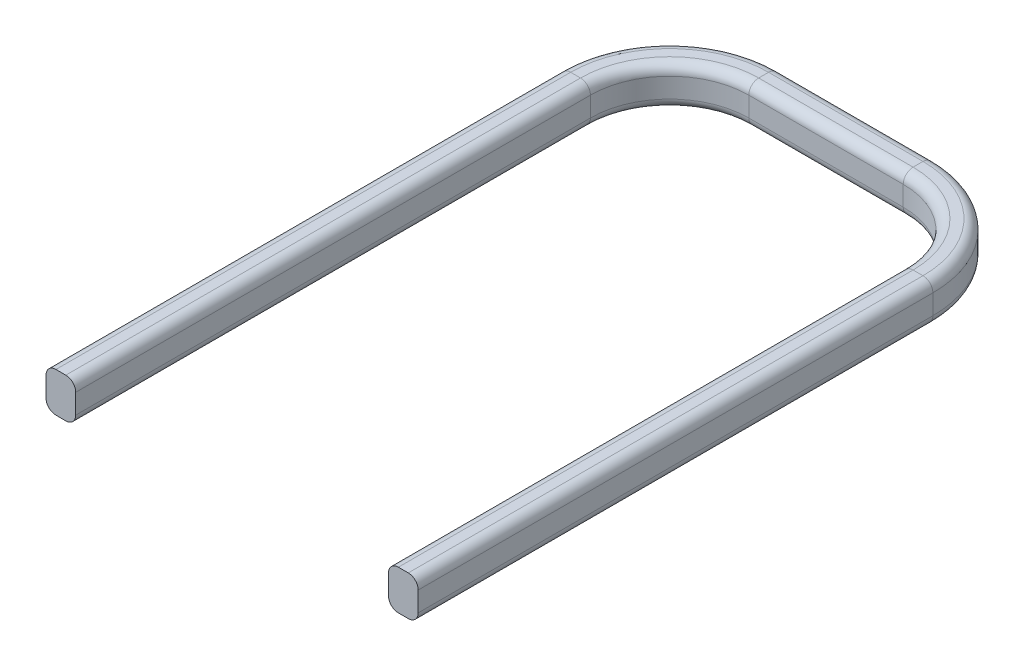
ISO-10303-21;
HEADER;
FILE_DESCRIPTION(('STEP AP214'),'2;1');
FILE_NAME('part.step','',(''),(''),'','','');
FILE_SCHEMA(('AUTOMOTIVE_DESIGN { 1 0 10303 214 1 1 1 1 }'));
ENDSEC;
DATA;
#1=APPLICATION_CONTEXT('core data for automotive mechanical design processes');
#2=APPLICATION_PROTOCOL_DEFINITION('international standard','automotive_design',2000,#1);
#3=PRODUCT_CONTEXT('',#1,'mechanical');
#4=PRODUCT('Part','Part','',(#3));
#5=PRODUCT_RELATED_PRODUCT_CATEGORY('part','',(#4));
#6=PRODUCT_DEFINITION_FORMATION('','',#4);
#7=PRODUCT_DEFINITION_CONTEXT('part definition',#1,'design');
#8=PRODUCT_DEFINITION('design','',#6,#7);
#9=PRODUCT_DEFINITION_SHAPE('','',#8);
#10=(LENGTH_UNIT() NAMED_UNIT(*) SI_UNIT(.MILLI.,.METRE.));
#11=(NAMED_UNIT(*) PLANE_ANGLE_UNIT() SI_UNIT($,.RADIAN.));
#12=(NAMED_UNIT(*) SI_UNIT($,.STERADIAN.) SOLID_ANGLE_UNIT());
#13=UNCERTAINTY_MEASURE_WITH_UNIT(LENGTH_MEASURE(1.E-05),#10,'distance_accuracy_value','');
#14=(GEOMETRIC_REPRESENTATION_CONTEXT(3) GLOBAL_UNCERTAINTY_ASSIGNED_CONTEXT((#13)) GLOBAL_UNIT_ASSIGNED_CONTEXT((#10,
#11,#12)) REPRESENTATION_CONTEXT('',''));
#15=CARTESIAN_POINT('',(0.,0.,0.));
#16=DIRECTION('',(0.,0.,1.));
#17=DIRECTION('',(1.,0.,0.));
#18=AXIS2_PLACEMENT_3D('',#15,#16,#17);
#19=CARTESIAN_POINT('',(0.,0.,0.));
#20=DIRECTION('',(0.,0.,1.));
#21=DIRECTION('',(1.,0.,0.));
#22=AXIS2_PLACEMENT_3D('',#19,#20,#21);
#23=PLANE('',#22);
#24=DIRECTION('',(0.,-1.,0.));
#25=VECTOR('',#24,1.);
#26=CARTESIAN_POINT('',(-2.0915,0.,0.));
#27=LINE('',#26,#25);
#28=CARTESIAN_POINT('',(-2.0915,0.33375,0.));
#29=VERTEX_POINT('',#28);
#30=CARTESIAN_POINT('',(-2.0915,0.11125,0.));
#31=VERTEX_POINT('',#30);
#32=EDGE_CURVE('E373',#29,#31,#27,.T.);
#33=ORIENTED_EDGE('',*,*,#32,.T.);
#34=CARTESIAN_POINT('',(-1.98025,0.11125,0.));
#35=DIRECTION('',(0.,0.,1.));
#36=DIRECTION('',(1.,0.,0.));
#37=AXIS2_PLACEMENT_3D('',#34,#35,#36);
#38=CIRCLE('',#37,0.11125);
#39=CARTESIAN_POINT('',(-1.98025,0.,0.));
#40=VERTEX_POINT('',#39);
#41=EDGE_CURVE('E308',#31,#40,#38,.T.);
#42=ORIENTED_EDGE('',*,*,#41,.T.);
#43=DIRECTION('',(1.,0.,0.));
#44=VECTOR('',#43,1.);
#45=CARTESIAN_POINT('',(-1.75775,0.,0.));
#46=LINE('',#45,#44);
#47=CARTESIAN_POINT('',(-1.869,0.,0.));
#48=VERTEX_POINT('',#47);
#49=EDGE_CURVE('E381',#40,#48,#46,.T.);
#50=ORIENTED_EDGE('',*,*,#49,.T.);
#51=CARTESIAN_POINT('',(-1.869,0.11125,0.));
#52=DIRECTION('',(0.,0.,1.));
#53=DIRECTION('',(1.,0.,0.));
#54=AXIS2_PLACEMENT_3D('',#51,#52,#53);
#55=CIRCLE('',#54,0.11125);
#56=CARTESIAN_POINT('',(-1.75775,0.11125,0.));
#57=VERTEX_POINT('',#56);
#58=EDGE_CURVE('E306',#48,#57,#55,.T.);
#59=ORIENTED_EDGE('',*,*,#58,.T.);
#60=DIRECTION('',(0.,1.,0.));
#61=VECTOR('',#60,1.);
#62=CARTESIAN_POINT('',(-1.75775,0.,0.));
#63=LINE('',#62,#61);
#64=CARTESIAN_POINT('',(-1.75775,0.33375,0.));
#65=VERTEX_POINT('',#64);
#66=EDGE_CURVE('E327',#57,#65,#63,.T.);
#67=ORIENTED_EDGE('',*,*,#66,.T.);
#68=CARTESIAN_POINT('',(-1.869,0.33375,0.));
#69=DIRECTION('',(0.,0.,1.));
#70=DIRECTION('',(1.,0.,0.));
#71=AXIS2_PLACEMENT_3D('',#68,#69,#70);
#72=CIRCLE('',#71,0.11125);
#73=CARTESIAN_POINT('',(-1.869,0.445,0.));
#74=VERTEX_POINT('',#73);
#75=EDGE_CURVE('E55',#65,#74,#72,.T.);
#76=ORIENTED_EDGE('',*,*,#75,.T.);
#77=DIRECTION('',(-1.,0.,0.));
#78=VECTOR('',#77,1.);
#79=CARTESIAN_POINT('',(-1.75775,0.445,0.));
#80=LINE('',#79,#78);
#81=CARTESIAN_POINT('',(-1.98025,0.445,0.));
#82=VERTEX_POINT('',#81);
#83=EDGE_CURVE('E375',#74,#82,#80,.T.);
#84=ORIENTED_EDGE('',*,*,#83,.T.);
#85=CARTESIAN_POINT('',(-1.98025,0.33375,0.));
#86=DIRECTION('',(0.,0.,1.));
#87=DIRECTION('',(1.,0.,0.));
#88=AXIS2_PLACEMENT_3D('',#85,#86,#87);
#89=CIRCLE('',#88,0.11125);
#90=EDGE_CURVE('E303',#82,#29,#89,.T.);
#91=ORIENTED_EDGE('',*,*,#90,.T.);
#92=EDGE_LOOP('',(#33,#42,#50,#59,#67,#76,#84,#91));
#93=FACE_BOUND('',#92,.T.);
#94=ADVANCED_FACE('F32',(#93),#23,.T.);
#95=CARTESIAN_POINT('',(0.,0.,0.));
#96=DIRECTION('',(0.,0.,-1.));
#97=DIRECTION('',(-1.,0.,0.));
#98=AXIS2_PLACEMENT_3D('',#95,#96,#97);
#99=PLANE('',#98);
#100=DIRECTION('',(-1.,0.,0.));
#101=VECTOR('',#100,1.);
#102=CARTESIAN_POINT('',(1.75775,0.,0.));
#103=LINE('',#102,#101);
#104=CARTESIAN_POINT('',(1.98025,0.,0.));
#105=VERTEX_POINT('',#104);
#106=CARTESIAN_POINT('',(1.869,0.,0.));
#107=VERTEX_POINT('',#106);
#108=EDGE_CURVE('E212',#105,#107,#103,.T.);
#109=ORIENTED_EDGE('',*,*,#108,.F.);
#110=CARTESIAN_POINT('',(1.98025,0.11125,0.));
#111=DIRECTION('',(0.,0.,-1.));
#112=DIRECTION('',(-1.,0.,0.));
#113=AXIS2_PLACEMENT_3D('',#110,#111,#112);
#114=CIRCLE('',#113,0.11125);
#115=CARTESIAN_POINT('',(2.0915,0.11125,0.));
#116=VERTEX_POINT('',#115);
#117=EDGE_CURVE('E195',#105,#116,#114,.F.);
#118=ORIENTED_EDGE('',*,*,#117,.T.);
#119=DIRECTION('',(0.,-1.,0.));
#120=VECTOR('',#119,1.);
#121=CARTESIAN_POINT('',(2.0915,0.,0.));
#122=LINE('',#121,#120);
#123=CARTESIAN_POINT('',(2.0915,0.33375,0.));
#124=VERTEX_POINT('',#123);
#125=EDGE_CURVE('E222',#124,#116,#122,.T.);
#126=ORIENTED_EDGE('',*,*,#125,.F.);
#127=CARTESIAN_POINT('',(1.98025,0.33375,0.));
#128=DIRECTION('',(0.,0.,-1.));
#129=DIRECTION('',(-1.,0.,0.));
#130=AXIS2_PLACEMENT_3D('',#127,#128,#129);
#131=CIRCLE('',#130,0.11125);
#132=CARTESIAN_POINT('',(1.98025,0.445,0.));
#133=VERTEX_POINT('',#132);
#134=EDGE_CURVE('E217',#124,#133,#131,.F.);
#135=ORIENTED_EDGE('',*,*,#134,.T.);
#136=DIRECTION('',(1.,0.,0.));
#137=VECTOR('',#136,1.);
#138=CARTESIAN_POINT('',(1.75775,0.445,0.));
#139=LINE('',#138,#137);
#140=CARTESIAN_POINT('',(1.869,0.445,0.));
#141=VERTEX_POINT('',#140);
#142=EDGE_CURVE('E225',#141,#133,#139,.T.);
#143=ORIENTED_EDGE('',*,*,#142,.F.);
#144=CARTESIAN_POINT('',(1.869,0.33375,0.));
#145=DIRECTION('',(0.,0.,-1.));
#146=DIRECTION('',(-1.,0.,0.));
#147=AXIS2_PLACEMENT_3D('',#144,#145,#146);
#148=CIRCLE('',#147,0.11125);
#149=CARTESIAN_POINT('',(1.75775,0.33375,0.));
#150=VERTEX_POINT('',#149);
#151=EDGE_CURVE('E231',#141,#150,#148,.F.);
#152=ORIENTED_EDGE('',*,*,#151,.T.);
#153=DIRECTION('',(0.,1.,0.));
#154=VECTOR('',#153,1.);
#155=CARTESIAN_POINT('',(1.75775,0.,0.));
#156=LINE('',#155,#154);
#157=CARTESIAN_POINT('',(1.75775,0.11125,0.));
#158=VERTEX_POINT('',#157);
#159=EDGE_CURVE('E427',#158,#150,#156,.T.);
#160=ORIENTED_EDGE('',*,*,#159,.F.);
#161=CARTESIAN_POINT('',(1.869,0.11125,0.));
#162=DIRECTION('',(0.,0.,-1.));
#163=DIRECTION('',(-1.,0.,0.));
#164=AXIS2_PLACEMENT_3D('',#161,#162,#163);
#165=CIRCLE('',#164,0.11125);
#166=EDGE_CURVE('E206',#158,#107,#165,.F.);
#167=ORIENTED_EDGE('',*,*,#166,.T.);
#168=EDGE_LOOP('',(#109,#118,#126,#135,#143,#152,#160,#167));
#169=FACE_BOUND('',#168,.T.);
#170=ADVANCED_FACE('F220',(#169),#99,.F.);
#171=CARTESIAN_POINT('',(-1.75775,0.,0.));
#172=DIRECTION('',(-1.,0.,0.));
#173=DIRECTION('',(0.,0.,1.));
#174=AXIS2_PLACEMENT_3D('',#171,#172,#173);
#175=PLANE('',#174);
#176=ORIENTED_EDGE('',*,*,#66,.F.);
#177=DIRECTION('',(0.,0.,-1.));
#178=VECTOR('',#177,1.);
#179=CARTESIAN_POINT('',(-1.75775,0.11125,0.));
#180=LINE('',#179,#178);
#181=CARTESIAN_POINT('',(-1.75775,0.11125,-5.78499999999999));
#182=VERTEX_POINT('',#181);
#183=EDGE_CURVE('E312',#57,#182,#180,.T.);
#184=ORIENTED_EDGE('',*,*,#183,.T.);
#185=DIRECTION('',(0.,1.,0.));
#186=VECTOR('',#185,1.);
#187=CARTESIAN_POINT('',(-1.75775,0.,-5.78499999999999));
#188=LINE('',#187,#186);
#189=CARTESIAN_POINT('',(-1.75775,0.33375,-5.78499999999999));
#190=VERTEX_POINT('',#189);
#191=EDGE_CURVE('E384',#182,#190,#188,.T.);
#192=ORIENTED_EDGE('',*,*,#191,.T.);
#193=DIRECTION('',(0.,0.,-1.));
#194=VECTOR('',#193,1.);
#195=CARTESIAN_POINT('',(-1.75775,0.33375,0.));
#196=LINE('',#195,#194);
#197=EDGE_CURVE('E310',#190,#65,#196,.F.);
#198=ORIENTED_EDGE('',*,*,#197,.T.);
#199=EDGE_LOOP('',(#176,#184,#192,#198));
#200=FACE_BOUND('',#199,.T.);
#201=ADVANCED_FACE('F491',(#200),#175,.F.);
#202=CARTESIAN_POINT('',(-1.75775,0.445,0.));
#203=DIRECTION('',(0.,-1.,0.));
#204=DIRECTION('',(1.,0.,0.));
#205=AXIS2_PLACEMENT_3D('',#202,#203,#204);
#206=PLANE('',#205);
#207=ORIENTED_EDGE('',*,*,#83,.F.);
#208=DIRECTION('',(0.,0.,-1.));
#209=VECTOR('',#208,1.);
#210=CARTESIAN_POINT('',(-1.869,0.445,0.));
#211=LINE('',#210,#209);
#212=CARTESIAN_POINT('',(-1.869,0.445,-5.78499999999999));
#213=VERTEX_POINT('',#212);
#214=EDGE_CURVE('E11',#74,#213,#211,.T.);
#215=ORIENTED_EDGE('',*,*,#214,.T.);
#216=DIRECTION('',(-1.,0.,0.));
#217=VECTOR('',#216,1.);
#218=CARTESIAN_POINT('',(-1.75775,0.445,-5.78499999999999));
#219=LINE('',#218,#217);
#220=CARTESIAN_POINT('',(-1.98025,0.445,-5.78499999999999));
#221=VERTEX_POINT('',#220);
#222=EDGE_CURVE('E393',#213,#221,#219,.T.);
#223=ORIENTED_EDGE('',*,*,#222,.T.);
#224=DIRECTION('',(0.,0.,-1.));
#225=VECTOR('',#224,1.);
#226=CARTESIAN_POINT('',(-1.98025,0.445,0.));
#227=LINE('',#226,#225);
#228=EDGE_CURVE('E41',#221,#82,#227,.F.);
#229=ORIENTED_EDGE('',*,*,#228,.T.);
#230=EDGE_LOOP('',(#207,#215,#223,#229));
#231=FACE_BOUND('',#230,.T.);
#232=ADVANCED_FACE('F497',(#231),#206,.F.);
#233=CARTESIAN_POINT('',(-2.0915,0.,0.));
#234=DIRECTION('',(1.,0.,0.));
#235=DIRECTION('',(0.,0.,-1.));
#236=AXIS2_PLACEMENT_3D('',#233,#234,#235);
#237=PLANE('',#236);
#238=DIRECTION('',(0.,-1.,0.));
#239=VECTOR('',#238,1.);
#240=CARTESIAN_POINT('',(-2.0915,0.,-5.78499999999999));
#241=LINE('',#240,#239);
#242=CARTESIAN_POINT('',(-2.0915,0.33375,-5.78499999999999));
#243=VERTEX_POINT('',#242);
#244=CARTESIAN_POINT('',(-2.0915,0.11125,-5.78499999999999));
#245=VERTEX_POINT('',#244);
#246=EDGE_CURVE('E390',#243,#245,#241,.T.);
#247=ORIENTED_EDGE('',*,*,#246,.T.);
#248=DIRECTION('',(0.,0.,-1.));
#249=VECTOR('',#248,1.);
#250=CARTESIAN_POINT('',(-2.0915,0.11125,0.));
#251=LINE('',#250,#249);
#252=EDGE_CURVE('E301',#245,#31,#251,.F.);
#253=ORIENTED_EDGE('',*,*,#252,.T.);
#254=ORIENTED_EDGE('',*,*,#32,.F.);
#255=DIRECTION('',(0.,0.,-1.));
#256=VECTOR('',#255,1.);
#257=CARTESIAN_POINT('',(-2.0915,0.33375,0.));
#258=LINE('',#257,#256);
#259=EDGE_CURVE('E299',#29,#243,#258,.T.);
#260=ORIENTED_EDGE('',*,*,#259,.T.);
#261=EDGE_LOOP('',(#247,#253,#254,#260));
#262=FACE_BOUND('',#261,.T.);
#263=ADVANCED_FACE('F378',(#262),#237,.F.);
#264=CARTESIAN_POINT('',(-1.75775,0.,0.));
#265=DIRECTION('',(0.,1.,0.));
#266=DIRECTION('',(-1.,0.,0.));
#267=AXIS2_PLACEMENT_3D('',#264,#265,#266);
#268=PLANE('',#267);
#269=ORIENTED_EDGE('',*,*,#49,.F.);
#270=DIRECTION('',(0.,0.,-1.));
#271=VECTOR('',#270,1.);
#272=CARTESIAN_POINT('',(-1.98025,0.,0.));
#273=LINE('',#272,#271);
#274=CARTESIAN_POINT('',(-1.98025,0.,-5.78499999999999));
#275=VERTEX_POINT('',#274);
#276=EDGE_CURVE('E297',#40,#275,#273,.T.);
#277=ORIENTED_EDGE('',*,*,#276,.T.);
#278=DIRECTION('',(1.,0.,0.));
#279=VECTOR('',#278,1.);
#280=CARTESIAN_POINT('',(-1.75775,0.,-5.78499999999999));
#281=LINE('',#280,#279);
#282=CARTESIAN_POINT('',(-1.869,0.,-5.78499999999999));
#283=VERTEX_POINT('',#282);
#284=EDGE_CURVE('E392',#275,#283,#281,.T.);
#285=ORIENTED_EDGE('',*,*,#284,.T.);
#286=DIRECTION('',(0.,0.,-1.));
#287=VECTOR('',#286,1.);
#288=CARTESIAN_POINT('',(-1.869,0.,0.));
#289=LINE('',#288,#287);
#290=EDGE_CURVE('E295',#283,#48,#289,.F.);
#291=ORIENTED_EDGE('',*,*,#290,.T.);
#292=EDGE_LOOP('',(#269,#277,#285,#291));
#293=FACE_BOUND('',#292,.T.);
#294=ADVANCED_FACE('F504',(#293),#268,.F.);
#295=CARTESIAN_POINT('',(-0.86775,0.,-5.785));
#296=DIRECTION('',(0.,-1.,0.));
#297=DIRECTION('',(0.,0.,-1.));
#298=AXIS2_PLACEMENT_3D('',#295,#296,#297);
#299=CYLINDRICAL_SURFACE('',#298,0.89);
#300=ORIENTED_EDGE('',*,*,#191,.F.);
#301=CARTESIAN_POINT('',(-0.86775,0.11125,-5.785));
#302=DIRECTION('',(0.,1.,0.));
#303=DIRECTION('',(0.,0.,1.));
#304=AXIS2_PLACEMENT_3D('',#301,#302,#303);
#305=CIRCLE('',#304,0.89);
#306=CARTESIAN_POINT('',(-0.86775,0.11125,-6.675));
#307=VERTEX_POINT('',#306);
#308=EDGE_CURVE('E276',#182,#307,#305,.F.);
#309=ORIENTED_EDGE('',*,*,#308,.T.);
#310=DIRECTION('',(0.,1.,0.));
#311=VECTOR('',#310,1.);
#312=CARTESIAN_POINT('',(-0.86775,0.,-6.675));
#313=LINE('',#312,#311);
#314=CARTESIAN_POINT('',(-0.86775,0.33375,-6.675));
#315=VERTEX_POINT('',#314);
#316=EDGE_CURVE('E410',#307,#315,#313,.T.);
#317=ORIENTED_EDGE('',*,*,#316,.T.);
#318=CARTESIAN_POINT('',(-0.86775,0.33375,-5.785));
#319=DIRECTION('',(0.,-1.,0.));
#320=DIRECTION('',(0.,0.,-1.));
#321=AXIS2_PLACEMENT_3D('',#318,#319,#320);
#322=CIRCLE('',#321,0.89);
#323=EDGE_CURVE('E274',#315,#190,#322,.F.);
#324=ORIENTED_EDGE('',*,*,#323,.T.);
#325=EDGE_LOOP('',(#300,#309,#317,#324));
#326=FACE_BOUND('',#325,.T.);
#327=ADVANCED_FACE('F486',(#326),#299,.F.);
#328=CARTESIAN_POINT('',(-1.75775,0.445,-5.78500000000001));
#329=DIRECTION('',(0.,-1.,0.));
#330=DIRECTION('',(0.,0.,-1.));
#331=AXIS2_PLACEMENT_3D('',#328,#329,#330);
#332=PLANE('',#331);
#333=ORIENTED_EDGE('',*,*,#222,.F.);
#334=CARTESIAN_POINT('',(-0.86775,0.445,-5.785));
#335=DIRECTION('',(0.,-1.,0.));
#336=DIRECTION('',(0.,0.,-1.));
#337=AXIS2_PLACEMENT_3D('',#334,#335,#336);
#338=CIRCLE('',#337,1.00125);
#339=CARTESIAN_POINT('',(-0.86775,0.445,-6.78625));
#340=VERTEX_POINT('',#339);
#341=EDGE_CURVE('E293',#213,#340,#338,.T.);
#342=ORIENTED_EDGE('',*,*,#341,.T.);
#343=DIRECTION('',(0.,0.,-1.));
#344=VECTOR('',#343,1.);
#345=CARTESIAN_POINT('',(-0.86775,0.445,-6.675));
#346=LINE('',#345,#344);
#347=CARTESIAN_POINT('',(-0.86775,0.445,-6.8975));
#348=VERTEX_POINT('',#347);
#349=EDGE_CURVE('E398',#340,#348,#346,.T.);
#350=ORIENTED_EDGE('',*,*,#349,.T.);
#351=CARTESIAN_POINT('',(-0.86775,0.445,-5.785));
#352=DIRECTION('',(0.,-1.,0.));
#353=DIRECTION('',(0.,0.,-1.));
#354=AXIS2_PLACEMENT_3D('',#351,#352,#353);
#355=CIRCLE('',#354,1.1125);
#356=EDGE_CURVE('E291',#348,#221,#355,.F.);
#357=ORIENTED_EDGE('',*,*,#356,.T.);
#358=EDGE_LOOP('',(#333,#342,#350,#357));
#359=FACE_BOUND('',#358,.T.);
#360=ADVANCED_FACE('F477',(#359),#332,.F.);
#361=CARTESIAN_POINT('',(-0.86775,0.,-5.785));
#362=DIRECTION('',(0.,-1.,0.));
#363=DIRECTION('',(0.,0.,-1.));
#364=AXIS2_PLACEMENT_3D('',#361,#362,#363);
#365=CYLINDRICAL_SURFACE('',#364,1.22375);
#366=DIRECTION('',(0.,-1.,0.));
#367=VECTOR('',#366,1.);
#368=CARTESIAN_POINT('',(-0.86775,0.,-7.00875));
#369=LINE('',#368,#367);
#370=CARTESIAN_POINT('',(-0.86775,0.33375,-7.00875));
#371=VERTEX_POINT('',#370);
#372=CARTESIAN_POINT('',(-0.86775,0.11125,-7.00875));
#373=VERTEX_POINT('',#372);
#374=EDGE_CURVE('E394',#371,#373,#369,.T.);
#375=ORIENTED_EDGE('',*,*,#374,.T.);
#376=CARTESIAN_POINT('',(-0.86775,0.11125,-5.785));
#377=DIRECTION('',(0.,1.,0.));
#378=DIRECTION('',(0.,0.,1.));
#379=AXIS2_PLACEMENT_3D('',#376,#377,#378);
#380=CIRCLE('',#379,1.22375);
#381=EDGE_CURVE('E259',#373,#245,#380,.T.);
#382=ORIENTED_EDGE('',*,*,#381,.T.);
#383=ORIENTED_EDGE('',*,*,#246,.F.);
#384=CARTESIAN_POINT('',(-0.86775,0.33375,-5.785));
#385=DIRECTION('',(0.,-1.,0.));
#386=DIRECTION('',(0.,0.,-1.));
#387=AXIS2_PLACEMENT_3D('',#384,#385,#386);
#388=CIRCLE('',#387,1.22375);
#389=EDGE_CURVE('E257',#243,#371,#388,.T.);
#390=ORIENTED_EDGE('',*,*,#389,.T.);
#391=EDGE_LOOP('',(#375,#382,#383,#390));
#392=FACE_BOUND('',#391,.T.);
#393=ADVANCED_FACE('F752',(#392),#365,.T.);
#394=CARTESIAN_POINT('',(-1.75775,0.,-5.78500000000001));
#395=DIRECTION('',(0.,1.,0.));
#396=DIRECTION('',(0.,0.,1.));
#397=AXIS2_PLACEMENT_3D('',#394,#395,#396);
#398=PLANE('',#397);
#399=ORIENTED_EDGE('',*,*,#284,.F.);
#400=CARTESIAN_POINT('',(-0.86775,0.,-5.785));
#401=DIRECTION('',(0.,1.,0.));
#402=DIRECTION('',(0.,0.,1.));
#403=AXIS2_PLACEMENT_3D('',#400,#401,#402);
#404=CIRCLE('',#403,1.1125);
#405=CARTESIAN_POINT('',(-0.86775,0.,-6.8975));
#406=VERTEX_POINT('',#405);
#407=EDGE_CURVE('E255',#275,#406,#404,.F.);
#408=ORIENTED_EDGE('',*,*,#407,.T.);
#409=DIRECTION('',(0.,0.,1.));
#410=VECTOR('',#409,1.);
#411=CARTESIAN_POINT('',(-0.86775,0.,-6.675));
#412=LINE('',#411,#410);
#413=CARTESIAN_POINT('',(-0.86775,0.,-6.78625));
#414=VERTEX_POINT('',#413);
#415=EDGE_CURVE('E397',#406,#414,#412,.T.);
#416=ORIENTED_EDGE('',*,*,#415,.T.);
#417=CARTESIAN_POINT('',(-0.86775,0.,-5.785));
#418=DIRECTION('',(0.,1.,0.));
#419=DIRECTION('',(0.,0.,1.));
#420=AXIS2_PLACEMENT_3D('',#417,#418,#419);
#421=CIRCLE('',#420,1.00125);
#422=EDGE_CURVE('E253',#414,#283,#421,.T.);
#423=ORIENTED_EDGE('',*,*,#422,.T.);
#424=EDGE_LOOP('',(#399,#408,#416,#423));
#425=FACE_BOUND('',#424,.T.);
#426=ADVANCED_FACE('F743',(#425),#398,.F.);
#427=CARTESIAN_POINT('',(-0.86775,0.,-6.675));
#428=DIRECTION('',(0.,0.,-1.));
#429=DIRECTION('',(-1.,0.,0.));
#430=AXIS2_PLACEMENT_3D('',#427,#428,#429);
#431=PLANE('',#430);
#432=ORIENTED_EDGE('',*,*,#316,.F.);
#433=DIRECTION('',(1.,0.,0.));
#434=VECTOR('',#433,1.);
#435=CARTESIAN_POINT('',(-0.86775,0.11125,-6.675));
#436=LINE('',#435,#434);
#437=CARTESIAN_POINT('',(0.867749999999993,0.11125,-6.675));
#438=VERTEX_POINT('',#437);
#439=EDGE_CURVE('E272',#307,#438,#436,.T.);
#440=ORIENTED_EDGE('',*,*,#439,.T.);
#441=DIRECTION('',(0.,1.,0.));
#442=VECTOR('',#441,1.);
#443=CARTESIAN_POINT('',(0.867749999999993,0.,-6.675));
#444=LINE('',#443,#442);
#445=CARTESIAN_POINT('',(0.867749999999993,0.33375,-6.675));
#446=VERTEX_POINT('',#445);
#447=EDGE_CURVE('E412',#438,#446,#444,.T.);
#448=ORIENTED_EDGE('',*,*,#447,.T.);
#449=DIRECTION('',(1.,0.,0.));
#450=VECTOR('',#449,1.);
#451=CARTESIAN_POINT('',(-0.86775,0.33375,-6.675));
#452=LINE('',#451,#450);
#453=EDGE_CURVE('E270',#446,#315,#452,.F.);
#454=ORIENTED_EDGE('',*,*,#453,.T.);
#455=EDGE_LOOP('',(#432,#440,#448,#454));
#456=FACE_BOUND('',#455,.T.);
#457=ADVANCED_FACE('F441',(#456),#431,.F.);
#458=CARTESIAN_POINT('',(-0.86775,0.445,-6.675));
#459=DIRECTION('',(0.,-1.,0.));
#460=DIRECTION('',(0.,0.,-1.));
#461=AXIS2_PLACEMENT_3D('',#458,#459,#460);
#462=PLANE('',#461);
#463=ORIENTED_EDGE('',*,*,#349,.F.);
#464=DIRECTION('',(1.,0.,0.));
#465=VECTOR('',#464,1.);
#466=CARTESIAN_POINT('',(-0.86775,0.445,-6.78625));
#467=LINE('',#466,#465);
#468=CARTESIAN_POINT('',(0.867749999999993,0.445,-6.78625));
#469=VERTEX_POINT('',#468);
#470=EDGE_CURVE('E289',#340,#469,#467,.T.);
#471=ORIENTED_EDGE('',*,*,#470,.T.);
#472=DIRECTION('',(0.,0.,-1.));
#473=VECTOR('',#472,1.);
#474=CARTESIAN_POINT('',(0.867749999999993,0.445,-6.675));
#475=LINE('',#474,#473);
#476=CARTESIAN_POINT('',(0.867749999999993,0.445,-6.8975));
#477=VERTEX_POINT('',#476);
#478=EDGE_CURVE('E403',#469,#477,#475,.T.);
#479=ORIENTED_EDGE('',*,*,#478,.T.);
#480=DIRECTION('',(1.,0.,0.));
#481=VECTOR('',#480,1.);
#482=CARTESIAN_POINT('',(-0.86775,0.445,-6.8975));
#483=LINE('',#482,#481);
#484=EDGE_CURVE('E287',#477,#348,#483,.F.);
#485=ORIENTED_EDGE('',*,*,#484,.T.);
#486=EDGE_LOOP('',(#463,#471,#479,#485));
#487=FACE_BOUND('',#486,.T.);
#488=ADVANCED_FACE('F474',(#487),#462,.F.);
#489=CARTESIAN_POINT('',(-0.86775,0.,-7.00875));
#490=DIRECTION('',(0.,0.,1.));
#491=DIRECTION('',(1.,0.,0.));
#492=AXIS2_PLACEMENT_3D('',#489,#490,#491);
#493=PLANE('',#492);
#494=DIRECTION('',(0.,-1.,0.));
#495=VECTOR('',#494,1.);
#496=CARTESIAN_POINT('',(0.867749999999993,0.,-7.00875));
#497=LINE('',#496,#495);
#498=CARTESIAN_POINT('',(0.867749999999993,0.33375,-7.00875));
#499=VERTEX_POINT('',#498);
#500=CARTESIAN_POINT('',(0.867749999999993,0.11125,-7.00875));
#501=VERTEX_POINT('',#500);
#502=EDGE_CURVE('E399',#499,#501,#497,.T.);
#503=ORIENTED_EDGE('',*,*,#502,.T.);
#504=DIRECTION('',(1.,0.,0.));
#505=VECTOR('',#504,1.);
#506=CARTESIAN_POINT('',(-0.86775,0.11125,-7.00875));
#507=LINE('',#506,#505);
#508=EDGE_CURVE('E251',#501,#373,#507,.F.);
#509=ORIENTED_EDGE('',*,*,#508,.T.);
#510=ORIENTED_EDGE('',*,*,#374,.F.);
#511=DIRECTION('',(1.,0.,0.));
#512=VECTOR('',#511,1.);
#513=CARTESIAN_POINT('',(-0.86775,0.33375,-7.00875));
#514=LINE('',#513,#512);
#515=EDGE_CURVE('E249',#371,#499,#514,.T.);
#516=ORIENTED_EDGE('',*,*,#515,.T.);
#517=EDGE_LOOP('',(#503,#509,#510,#516));
#518=FACE_BOUND('',#517,.T.);
#519=ADVANCED_FACE('F718',(#518),#493,.F.);
#520=CARTESIAN_POINT('',(-0.86775,0.,-6.675));
#521=DIRECTION('',(0.,1.,0.));
#522=DIRECTION('',(0.,0.,1.));
#523=AXIS2_PLACEMENT_3D('',#520,#521,#522);
#524=PLANE('',#523);
#525=ORIENTED_EDGE('',*,*,#415,.F.);
#526=DIRECTION('',(1.,0.,0.));
#527=VECTOR('',#526,1.);
#528=CARTESIAN_POINT('',(-0.86775,0.,-6.8975));
#529=LINE('',#528,#527);
#530=CARTESIAN_POINT('',(0.867749999999993,0.,-6.8975));
#531=VERTEX_POINT('',#530);
#532=EDGE_CURVE('E247',#406,#531,#529,.T.);
#533=ORIENTED_EDGE('',*,*,#532,.T.);
#534=DIRECTION('',(0.,0.,1.));
#535=VECTOR('',#534,1.);
#536=CARTESIAN_POINT('',(0.867749999999993,0.,-6.675));
#537=LINE('',#536,#535);
#538=CARTESIAN_POINT('',(0.867749999999993,0.,-6.78625));
#539=VERTEX_POINT('',#538);
#540=EDGE_CURVE('E402',#531,#539,#537,.T.);
#541=ORIENTED_EDGE('',*,*,#540,.T.);
#542=DIRECTION('',(1.,0.,0.));
#543=VECTOR('',#542,1.);
#544=CARTESIAN_POINT('',(-0.86775,0.,-6.78625));
#545=LINE('',#544,#543);
#546=EDGE_CURVE('E245',#539,#414,#545,.F.);
#547=ORIENTED_EDGE('',*,*,#546,.T.);
#548=EDGE_LOOP('',(#525,#533,#541,#547));
#549=FACE_BOUND('',#548,.T.);
#550=ADVANCED_FACE('F709',(#549),#524,.F.);
#551=CARTESIAN_POINT('',(0.86775,0.,-5.785));
#552=DIRECTION('',(0.,-1.,0.));
#553=DIRECTION('',(0.,0.,-1.));
#554=AXIS2_PLACEMENT_3D('',#551,#552,#553);
#555=CYLINDRICAL_SURFACE('',#554,0.89);
#556=ORIENTED_EDGE('',*,*,#447,.F.);
#557=CARTESIAN_POINT('',(0.86775,0.11125,-5.785));
#558=DIRECTION('',(0.,1.,0.));
#559=DIRECTION('',(0.,0.,1.));
#560=AXIS2_PLACEMENT_3D('',#557,#558,#559);
#561=CIRCLE('',#560,0.89);
#562=CARTESIAN_POINT('',(1.75775,0.11125,-5.78499999999999));
#563=VERTEX_POINT('',#562);
#564=EDGE_CURVE('E268',#438,#563,#561,.F.);
#565=ORIENTED_EDGE('',*,*,#564,.T.);
#566=DIRECTION('',(0.,1.,0.));
#567=VECTOR('',#566,1.);
#568=CARTESIAN_POINT('',(1.75775,0.,-5.78499999999999));
#569=LINE('',#568,#567);
#570=CARTESIAN_POINT('',(1.75775,0.33375,-5.78499999999999));
#571=VERTEX_POINT('',#570);
#572=EDGE_CURVE('E414',#563,#571,#569,.T.);
#573=ORIENTED_EDGE('',*,*,#572,.T.);
#574=CARTESIAN_POINT('',(0.86775,0.33375,-5.785));
#575=DIRECTION('',(0.,-1.,0.));
#576=DIRECTION('',(0.,0.,-1.));
#577=AXIS2_PLACEMENT_3D('',#574,#575,#576);
#578=CIRCLE('',#577,0.89);
#579=EDGE_CURVE('E266',#571,#446,#578,.F.);
#580=ORIENTED_EDGE('',*,*,#579,.T.);
#581=EDGE_LOOP('',(#556,#565,#573,#580));
#582=FACE_BOUND('',#581,.T.);
#583=ADVANCED_FACE('F700',(#582),#555,.F.);
#584=CARTESIAN_POINT('',(0.867749999999994,0.445,-6.675));
#585=DIRECTION('',(0.,-1.,0.));
#586=DIRECTION('',(0.,0.,-1.));
#587=AXIS2_PLACEMENT_3D('',#584,#585,#586);
#588=PLANE('',#587);
#589=ORIENTED_EDGE('',*,*,#478,.F.);
#590=CARTESIAN_POINT('',(0.86775,0.445,-5.785));
#591=DIRECTION('',(0.,-1.,0.));
#592=DIRECTION('',(0.,0.,-1.));
#593=AXIS2_PLACEMENT_3D('',#590,#591,#592);
#594=CIRCLE('',#593,1.00125);
#595=CARTESIAN_POINT('',(1.869,0.445,-5.78499999999999));
#596=VERTEX_POINT('',#595);
#597=EDGE_CURVE('E285',#469,#596,#594,.T.);
#598=ORIENTED_EDGE('',*,*,#597,.T.);
#599=DIRECTION('',(1.,0.,0.));
#600=VECTOR('',#599,1.);
#601=CARTESIAN_POINT('',(1.75775,0.445,-5.78499999999999));
#602=LINE('',#601,#600);
#603=CARTESIAN_POINT('',(1.98025,0.445,-5.78499999999999));
#604=VERTEX_POINT('',#603);
#605=EDGE_CURVE('E406',#596,#604,#602,.T.);
#606=ORIENTED_EDGE('',*,*,#605,.T.);
#607=CARTESIAN_POINT('',(0.86775,0.445,-5.785));
#608=DIRECTION('',(0.,-1.,0.));
#609=DIRECTION('',(0.,0.,-1.));
#610=AXIS2_PLACEMENT_3D('',#607,#608,#609);
#611=CIRCLE('',#610,1.1125);
#612=EDGE_CURVE('E283',#604,#477,#611,.F.);
#613=ORIENTED_EDGE('',*,*,#612,.T.);
#614=EDGE_LOOP('',(#589,#598,#606,#613));
#615=FACE_BOUND('',#614,.T.);
#616=ADVANCED_FACE('F457',(#615),#588,.F.);
#617=CARTESIAN_POINT('',(0.86775,0.,-5.785));
#618=DIRECTION('',(0.,-1.,0.));
#619=DIRECTION('',(0.,0.,-1.));
#620=AXIS2_PLACEMENT_3D('',#617,#618,#619);
#621=CYLINDRICAL_SURFACE('',#620,1.22375);
#622=DIRECTION('',(0.,-1.,0.));
#623=VECTOR('',#622,1.);
#624=CARTESIAN_POINT('',(2.0915,0.,-5.78499999999999));
#625=LINE('',#624,#623);
#626=CARTESIAN_POINT('',(2.0915,0.33375,-5.78499999999999));
#627=VERTEX_POINT('',#626);
#628=CARTESIAN_POINT('',(2.0915,0.11125,-5.78499999999999));
#629=VERTEX_POINT('',#628);
#630=EDGE_CURVE('E404',#627,#629,#625,.T.);
#631=ORIENTED_EDGE('',*,*,#630,.T.);
#632=CARTESIAN_POINT('',(0.86775,0.11125,-5.785));
#633=DIRECTION('',(0.,1.,0.));
#634=DIRECTION('',(0.,0.,1.));
#635=AXIS2_PLACEMENT_3D('',#632,#633,#634);
#636=CIRCLE('',#635,1.22375);
#637=EDGE_CURVE('E243',#629,#501,#636,.T.);
#638=ORIENTED_EDGE('',*,*,#637,.T.);
#639=ORIENTED_EDGE('',*,*,#502,.F.);
#640=CARTESIAN_POINT('',(0.86775,0.33375,-5.785));
#641=DIRECTION('',(0.,-1.,0.));
#642=DIRECTION('',(0.,0.,-1.));
#643=AXIS2_PLACEMENT_3D('',#640,#641,#642);
#644=CIRCLE('',#643,1.22375);
#645=EDGE_CURVE('E241',#499,#627,#644,.T.);
#646=ORIENTED_EDGE('',*,*,#645,.T.);
#647=EDGE_LOOP('',(#631,#638,#639,#646));
#648=FACE_BOUND('',#647,.T.);
#649=ADVANCED_FACE('F682',(#648),#621,.T.);
#650=CARTESIAN_POINT('',(0.867749999999994,0.,-6.675));
#651=DIRECTION('',(0.,1.,0.));
#652=DIRECTION('',(0.,0.,1.));
#653=AXIS2_PLACEMENT_3D('',#650,#651,#652);
#654=PLANE('',#653);
#655=ORIENTED_EDGE('',*,*,#540,.F.);
#656=CARTESIAN_POINT('',(0.86775,0.,-5.785));
#657=DIRECTION('',(0.,1.,0.));
#658=DIRECTION('',(0.,0.,1.));
#659=AXIS2_PLACEMENT_3D('',#656,#657,#658);
#660=CIRCLE('',#659,1.1125);
#661=CARTESIAN_POINT('',(1.98025,0.,-5.78499999999999));
#662=VERTEX_POINT('',#661);
#663=EDGE_CURVE('E239',#531,#662,#660,.F.);
#664=ORIENTED_EDGE('',*,*,#663,.T.);
#665=DIRECTION('',(-1.,0.,0.));
#666=VECTOR('',#665,1.);
#667=CARTESIAN_POINT('',(1.75775,0.,-5.78499999999999));
#668=LINE('',#667,#666);
#669=CARTESIAN_POINT('',(1.869,0.,-5.78499999999999));
#670=VERTEX_POINT('',#669);
#671=EDGE_CURVE('E215',#662,#670,#668,.T.);
#672=ORIENTED_EDGE('',*,*,#671,.T.);
#673=CARTESIAN_POINT('',(0.86775,0.,-5.785));
#674=DIRECTION('',(0.,1.,0.));
#675=DIRECTION('',(0.,0.,1.));
#676=AXIS2_PLACEMENT_3D('',#673,#674,#675);
#677=CIRCLE('',#676,1.00125);
#678=EDGE_CURVE('E237',#670,#539,#677,.T.);
#679=ORIENTED_EDGE('',*,*,#678,.T.);
#680=EDGE_LOOP('',(#655,#664,#672,#679));
#681=FACE_BOUND('',#680,.T.);
#682=ADVANCED_FACE('F524',(#681),#654,.F.);
#683=CARTESIAN_POINT('',(1.75775,0.,-5.78499999999999));
#684=DIRECTION('',(1.,0.,0.));
#685=DIRECTION('',(0.,0.,-1.));
#686=AXIS2_PLACEMENT_3D('',#683,#684,#685);
#687=PLANE('',#686);
#688=ORIENTED_EDGE('',*,*,#572,.F.);
#689=DIRECTION('',(0.,0.,1.));
#690=VECTOR('',#689,1.);
#691=CARTESIAN_POINT('',(1.75775,0.11125,-5.78499999999999));
#692=LINE('',#691,#690);
#693=EDGE_CURVE('E263',#563,#158,#692,.T.);
#694=ORIENTED_EDGE('',*,*,#693,.T.);
#695=ORIENTED_EDGE('',*,*,#159,.T.);
#696=DIRECTION('',(0.,0.,1.));
#697=VECTOR('',#696,1.);
#698=CARTESIAN_POINT('',(1.75775,0.33375,-5.78499999999999));
#699=LINE('',#698,#697);
#700=EDGE_CURVE('E261',#150,#571,#699,.F.);
#701=ORIENTED_EDGE('',*,*,#700,.T.);
#702=EDGE_LOOP('',(#688,#694,#695,#701));
#703=FACE_BOUND('',#702,.T.);
#704=ADVANCED_FACE('F665',(#703),#687,.F.);
#705=CARTESIAN_POINT('',(1.75775,0.445,-5.78499999999999));
#706=DIRECTION('',(0.,-1.,0.));
#707=DIRECTION('',(1.,0.,0.));
#708=AXIS2_PLACEMENT_3D('',#705,#706,#707);
#709=PLANE('',#708);
#710=ORIENTED_EDGE('',*,*,#605,.F.);
#711=DIRECTION('',(0.,0.,1.));
#712=VECTOR('',#711,1.);
#713=CARTESIAN_POINT('',(1.869,0.445,-5.78499999999999));
#714=LINE('',#713,#712);
#715=EDGE_CURVE('E280',#596,#141,#714,.T.);
#716=ORIENTED_EDGE('',*,*,#715,.T.);
#717=ORIENTED_EDGE('',*,*,#142,.T.);
#718=DIRECTION('',(0.,0.,1.));
#719=VECTOR('',#718,1.);
#720=CARTESIAN_POINT('',(1.98025,0.445,-5.78499999999999));
#721=LINE('',#720,#719);
#722=EDGE_CURVE('E278',#133,#604,#721,.F.);
#723=ORIENTED_EDGE('',*,*,#722,.T.);
#724=EDGE_LOOP('',(#710,#716,#717,#723));
#725=FACE_BOUND('',#724,.T.);
#726=ADVANCED_FACE('F460',(#725),#709,.F.);
#727=CARTESIAN_POINT('',(2.0915,0.,-5.78499999999999));
#728=DIRECTION('',(-1.,0.,0.));
#729=DIRECTION('',(0.,0.,1.));
#730=AXIS2_PLACEMENT_3D('',#727,#728,#729);
#731=PLANE('',#730);
#732=ORIENTED_EDGE('',*,*,#125,.T.);
#733=DIRECTION('',(0.,0.,1.));
#734=VECTOR('',#733,1.);
#735=CARTESIAN_POINT('',(2.0915,0.11125,-5.78499999999999));
#736=LINE('',#735,#734);
#737=EDGE_CURVE('E200',#116,#629,#736,.F.);
#738=ORIENTED_EDGE('',*,*,#737,.T.);
#739=ORIENTED_EDGE('',*,*,#630,.F.);
#740=DIRECTION('',(0.,0.,1.));
#741=VECTOR('',#740,1.);
#742=CARTESIAN_POINT('',(2.0915,0.33375,-5.78499999999999));
#743=LINE('',#742,#741);
#744=EDGE_CURVE('E205',#627,#124,#743,.T.);
#745=ORIENTED_EDGE('',*,*,#744,.T.);
#746=EDGE_LOOP('',(#732,#738,#739,#745));
#747=FACE_BOUND('',#746,.T.);
#748=ADVANCED_FACE('F511',(#747),#731,.F.);
#749=CARTESIAN_POINT('',(1.75775,0.,-5.78499999999999));
#750=DIRECTION('',(0.,1.,0.));
#751=DIRECTION('',(-1.,0.,0.));
#752=AXIS2_PLACEMENT_3D('',#749,#750,#751);
#753=PLANE('',#752);
#754=ORIENTED_EDGE('',*,*,#671,.F.);
#755=DIRECTION('',(0.,0.,1.));
#756=VECTOR('',#755,1.);
#757=CARTESIAN_POINT('',(1.98025,0.,-5.78499999999999));
#758=LINE('',#757,#756);
#759=EDGE_CURVE('E199',#662,#105,#758,.T.);
#760=ORIENTED_EDGE('',*,*,#759,.T.);
#761=ORIENTED_EDGE('',*,*,#108,.T.);
#762=DIRECTION('',(0.,0.,1.));
#763=VECTOR('',#762,1.);
#764=CARTESIAN_POINT('',(1.869,0.,-5.78499999999999));
#765=LINE('',#764,#763);
#766=EDGE_CURVE('E218',#107,#670,#765,.F.);
#767=ORIENTED_EDGE('',*,*,#766,.T.);
#768=EDGE_LOOP('',(#754,#760,#761,#767));
#769=FACE_BOUND('',#768,.T.);
#770=ADVANCED_FACE('F211',(#769),#753,.F.);
#771=CARTESIAN_POINT('',(-1.98025,0.11125,0.));
#772=DIRECTION('',(0.,0.,-1.));
#773=DIRECTION('',(-1.,0.,0.));
#774=AXIS2_PLACEMENT_3D('',#771,#772,#773);
#775=CYLINDRICAL_SURFACE('',#774,0.11125);
#776=ORIENTED_EDGE('',*,*,#41,.F.);
#777=ORIENTED_EDGE('',*,*,#252,.F.);
#778=CARTESIAN_POINT('',(-1.98025,0.11125,-5.78499999999999));
#779=DIRECTION('',(0.,0.,-1.));
#780=DIRECTION('',(-1.,0.,0.));
#781=AXIS2_PLACEMENT_3D('',#778,#779,#780);
#782=CIRCLE('',#781,0.11125);
#783=EDGE_CURVE('E324',#275,#245,#782,.T.);
#784=ORIENTED_EDGE('',*,*,#783,.F.);
#785=ORIENTED_EDGE('',*,*,#276,.F.);
#786=EDGE_LOOP('',(#776,#777,#784,#785));
#787=FACE_BOUND('',#786,.T.);
#788=ADVANCED_FACE('F510',(#787),#775,.T.);
#789=CARTESIAN_POINT('',(-0.86775,0.11125,-5.785));
#790=DIRECTION('',(0.,1.,0.));
#791=DIRECTION('',(0.,0.,1.));
#792=AXIS2_PLACEMENT_3D('',#789,#790,#791);
#793=TOROIDAL_SURFACE('',#792,1.1125,0.11125);
#794=ORIENTED_EDGE('',*,*,#783,.T.);
#795=ORIENTED_EDGE('',*,*,#381,.F.);
#796=CARTESIAN_POINT('',(-0.86775,0.11125,-6.8975));
#797=DIRECTION('',(1.,0.,0.));
#798=DIRECTION('',(0.,0.,-1.));
#799=AXIS2_PLACEMENT_3D('',#796,#797,#798);
#800=CIRCLE('',#799,0.11125);
#801=EDGE_CURVE('E321',#406,#373,#800,.T.);
#802=ORIENTED_EDGE('',*,*,#801,.F.);
#803=ORIENTED_EDGE('',*,*,#407,.F.);
#804=EDGE_LOOP('',(#794,#795,#802,#803));
#805=FACE_BOUND('',#804,.T.);
#806=ADVANCED_FACE('F517',(#805),#793,.T.);
#807=CARTESIAN_POINT('',(-0.86775,0.11125,-6.8975));
#808=DIRECTION('',(1.,0.,0.));
#809=DIRECTION('',(0.,0.,-1.));
#810=AXIS2_PLACEMENT_3D('',#807,#808,#809);
#811=CYLINDRICAL_SURFACE('',#810,0.11125);
#812=ORIENTED_EDGE('',*,*,#801,.T.);
#813=ORIENTED_EDGE('',*,*,#508,.F.);
#814=CARTESIAN_POINT('',(0.867749999999993,0.11125,-6.8975));
#815=DIRECTION('',(1.,0.,0.));
#816=DIRECTION('',(0.,0.,-1.));
#817=AXIS2_PLACEMENT_3D('',#814,#815,#816);
#818=CIRCLE('',#817,0.11125);
#819=EDGE_CURVE('E317',#531,#501,#818,.T.);
#820=ORIENTED_EDGE('',*,*,#819,.F.);
#821=ORIENTED_EDGE('',*,*,#532,.F.);
#822=EDGE_LOOP('',(#812,#813,#820,#821));
#823=FACE_BOUND('',#822,.T.);
#824=ADVANCED_FACE('F536',(#823),#811,.T.);
#825=CARTESIAN_POINT('',(0.86775,0.11125,-5.785));
#826=DIRECTION('',(0.,1.,0.));
#827=DIRECTION('',(0.,0.,1.));
#828=AXIS2_PLACEMENT_3D('',#825,#826,#827);
#829=TOROIDAL_SURFACE('',#828,1.1125,0.11125);
#830=ORIENTED_EDGE('',*,*,#819,.T.);
#831=ORIENTED_EDGE('',*,*,#637,.F.);
#832=CARTESIAN_POINT('',(1.98025,0.11125,-5.78499999999999));
#833=DIRECTION('',(0.,0.,1.));
#834=DIRECTION('',(1.,0.,0.));
#835=AXIS2_PLACEMENT_3D('',#832,#833,#834);
#836=CIRCLE('',#835,0.11125);
#837=EDGE_CURVE('E315',#662,#629,#836,.T.);
#838=ORIENTED_EDGE('',*,*,#837,.F.);
#839=ORIENTED_EDGE('',*,*,#663,.F.);
#840=EDGE_LOOP('',(#830,#831,#838,#839));
#841=FACE_BOUND('',#840,.T.);
#842=ADVANCED_FACE('F533',(#841),#829,.T.);
#843=CARTESIAN_POINT('',(1.98025,0.11125,-5.78499999999999));
#844=DIRECTION('',(0.,0.,1.));
#845=DIRECTION('',(1.,0.,0.));
#846=AXIS2_PLACEMENT_3D('',#843,#844,#845);
#847=CYLINDRICAL_SURFACE('',#846,0.11125);
#848=ORIENTED_EDGE('',*,*,#837,.T.);
#849=ORIENTED_EDGE('',*,*,#737,.F.);
#850=ORIENTED_EDGE('',*,*,#117,.F.);
#851=ORIENTED_EDGE('',*,*,#759,.F.);
#852=EDGE_LOOP('',(#848,#849,#850,#851));
#853=FACE_BOUND('',#852,.T.);
#854=ADVANCED_FACE('F198',(#853),#847,.T.);
#855=CARTESIAN_POINT('',(-1.869,0.11125,0.));
#856=DIRECTION('',(0.,0.,-1.));
#857=DIRECTION('',(-1.,0.,0.));
#858=AXIS2_PLACEMENT_3D('',#855,#856,#857);
#859=CYLINDRICAL_SURFACE('',#858,0.11125);
#860=ORIENTED_EDGE('',*,*,#58,.F.);
#861=ORIENTED_EDGE('',*,*,#290,.F.);
#862=CARTESIAN_POINT('',(-1.869,0.11125,-5.78499999999999));
#863=DIRECTION('',(0.,0.,-1.));
#864=DIRECTION('',(-1.,0.,0.));
#865=AXIS2_PLACEMENT_3D('',#862,#863,#864);
#866=CIRCLE('',#865,0.11125);
#867=EDGE_CURVE('E318',#182,#283,#866,.T.);
#868=ORIENTED_EDGE('',*,*,#867,.F.);
#869=ORIENTED_EDGE('',*,*,#183,.F.);
#870=EDGE_LOOP('',(#860,#861,#868,#869));
#871=FACE_BOUND('',#870,.T.);
#872=ADVANCED_FACE('F532',(#871),#859,.T.);
#873=CARTESIAN_POINT('',(-0.86775,0.11125,-5.785));
#874=DIRECTION('',(0.,1.,0.));
#875=DIRECTION('',(0.,0.,1.));
#876=AXIS2_PLACEMENT_3D('',#873,#874,#875);
#877=TOROIDAL_SURFACE('',#876,1.00125,0.11125);
#878=ORIENTED_EDGE('',*,*,#867,.T.);
#879=ORIENTED_EDGE('',*,*,#422,.F.);
#880=CARTESIAN_POINT('',(-0.86775,0.11125,-6.78625));
#881=DIRECTION('',(1.,0.,0.));
#882=DIRECTION('',(0.,0.,-1.));
#883=AXIS2_PLACEMENT_3D('',#880,#881,#882);
#884=CIRCLE('',#883,0.11125);
#885=EDGE_CURVE('E335',#307,#414,#884,.T.);
#886=ORIENTED_EDGE('',*,*,#885,.F.);
#887=ORIENTED_EDGE('',*,*,#308,.F.);
#888=EDGE_LOOP('',(#878,#879,#886,#887));
#889=FACE_BOUND('',#888,.T.);
#890=ADVANCED_FACE('F555',(#889),#877,.T.);
#891=CARTESIAN_POINT('',(-0.86775,0.11125,-6.78625));
#892=DIRECTION('',(1.,0.,0.));
#893=DIRECTION('',(0.,0.,-1.));
#894=AXIS2_PLACEMENT_3D('',#891,#892,#893);
#895=CYLINDRICAL_SURFACE('',#894,0.11125);
#896=ORIENTED_EDGE('',*,*,#885,.T.);
#897=ORIENTED_EDGE('',*,*,#546,.F.);
#898=CARTESIAN_POINT('',(0.867749999999993,0.11125,-6.78625));
#899=DIRECTION('',(1.,0.,0.));
#900=DIRECTION('',(0.,0.,-1.));
#901=AXIS2_PLACEMENT_3D('',#898,#899,#900);
#902=CIRCLE('',#901,0.11125);
#903=EDGE_CURVE('E331',#438,#539,#902,.T.);
#904=ORIENTED_EDGE('',*,*,#903,.F.);
#905=ORIENTED_EDGE('',*,*,#439,.F.);
#906=EDGE_LOOP('',(#896,#897,#904,#905));
#907=FACE_BOUND('',#906,.T.);
#908=ADVANCED_FACE('F551',(#907),#895,.T.);
#909=CARTESIAN_POINT('',(0.86775,0.11125,-5.785));
#910=DIRECTION('',(0.,1.,0.));
#911=DIRECTION('',(0.,0.,1.));
#912=AXIS2_PLACEMENT_3D('',#909,#910,#911);
#913=TOROIDAL_SURFACE('',#912,1.00125,0.11125);
#914=ORIENTED_EDGE('',*,*,#903,.T.);
#915=ORIENTED_EDGE('',*,*,#678,.F.);
#916=CARTESIAN_POINT('',(1.869,0.11125,-5.78499999999999));
#917=DIRECTION('',(0.,0.,1.));
#918=DIRECTION('',(1.,0.,0.));
#919=AXIS2_PLACEMENT_3D('',#916,#917,#918);
#920=CIRCLE('',#919,0.11125);
#921=EDGE_CURVE('E328',#563,#670,#920,.T.);
#922=ORIENTED_EDGE('',*,*,#921,.F.);
#923=ORIENTED_EDGE('',*,*,#564,.F.);
#924=EDGE_LOOP('',(#914,#915,#922,#923));
#925=FACE_BOUND('',#924,.T.);
#926=ADVANCED_FACE('F547',(#925),#913,.T.);
#927=CARTESIAN_POINT('',(1.869,0.11125,-5.78499999999999));
#928=DIRECTION('',(0.,0.,1.));
#929=DIRECTION('',(1.,0.,0.));
#930=AXIS2_PLACEMENT_3D('',#927,#928,#929);
#931=CYLINDRICAL_SURFACE('',#930,0.11125);
#932=ORIENTED_EDGE('',*,*,#921,.T.);
#933=ORIENTED_EDGE('',*,*,#766,.F.);
#934=ORIENTED_EDGE('',*,*,#166,.F.);
#935=ORIENTED_EDGE('',*,*,#693,.F.);
#936=EDGE_LOOP('',(#932,#933,#934,#935));
#937=FACE_BOUND('',#936,.T.);
#938=ADVANCED_FACE('F544',(#937),#931,.T.);
#939=CARTESIAN_POINT('',(-1.869,0.33375,0.));
#940=DIRECTION('',(0.,0.,-1.));
#941=DIRECTION('',(-1.,0.,0.));
#942=AXIS2_PLACEMENT_3D('',#939,#940,#941);
#943=CYLINDRICAL_SURFACE('',#942,0.11125);
#944=ORIENTED_EDGE('',*,*,#75,.F.);
#945=ORIENTED_EDGE('',*,*,#197,.F.);
#946=CARTESIAN_POINT('',(-1.869,0.33375,-5.78499999999999));
#947=DIRECTION('',(0.,0.,-1.));
#948=DIRECTION('',(-1.,0.,0.));
#949=AXIS2_PLACEMENT_3D('',#946,#947,#948);
#950=CIRCLE('',#949,0.11125);
#951=EDGE_CURVE('E332',#213,#190,#950,.T.);
#952=ORIENTED_EDGE('',*,*,#951,.F.);
#953=ORIENTED_EDGE('',*,*,#214,.F.);
#954=EDGE_LOOP('',(#944,#945,#952,#953));
#955=FACE_BOUND('',#954,.T.);
#956=ADVANCED_FACE('F495',(#955),#943,.T.);
#957=CARTESIAN_POINT('',(-0.86775,0.33375,-5.785));
#958=DIRECTION('',(0.,-1.,0.));
#959=DIRECTION('',(0.,0.,-1.));
#960=AXIS2_PLACEMENT_3D('',#957,#958,#959);
#961=TOROIDAL_SURFACE('',#960,1.00125,0.11125);
#962=ORIENTED_EDGE('',*,*,#951,.T.);
#963=ORIENTED_EDGE('',*,*,#323,.F.);
#964=CARTESIAN_POINT('',(-0.86775,0.33375,-6.78625));
#965=DIRECTION('',(1.,0.,0.));
#966=DIRECTION('',(0.,0.,-1.));
#967=AXIS2_PLACEMENT_3D('',#964,#965,#966);
#968=CIRCLE('',#967,0.11125);
#969=EDGE_CURVE('E346',#340,#315,#968,.T.);
#970=ORIENTED_EDGE('',*,*,#969,.F.);
#971=ORIENTED_EDGE('',*,*,#341,.F.);
#972=EDGE_LOOP('',(#962,#963,#970,#971));
#973=FACE_BOUND('',#972,.T.);
#974=ADVANCED_FACE('F481',(#973),#961,.T.);
#975=CARTESIAN_POINT('',(-0.86775,0.33375,-6.78625));
#976=DIRECTION('',(1.,0.,0.));
#977=DIRECTION('',(0.,0.,-1.));
#978=AXIS2_PLACEMENT_3D('',#975,#976,#977);
#979=CYLINDRICAL_SURFACE('',#978,0.11125);
#980=ORIENTED_EDGE('',*,*,#969,.T.);
#981=ORIENTED_EDGE('',*,*,#453,.F.);
#982=CARTESIAN_POINT('',(0.867749999999993,0.33375,-6.78625));
#983=DIRECTION('',(1.,0.,0.));
#984=DIRECTION('',(0.,0.,-1.));
#985=AXIS2_PLACEMENT_3D('',#982,#983,#984);
#986=CIRCLE('',#985,0.11125);
#987=EDGE_CURVE('E343',#469,#446,#986,.T.);
#988=ORIENTED_EDGE('',*,*,#987,.F.);
#989=ORIENTED_EDGE('',*,*,#470,.F.);
#990=EDGE_LOOP('',(#980,#981,#988,#989));
#991=FACE_BOUND('',#990,.T.);
#992=ADVANCED_FACE('F447',(#991),#979,.T.);
#993=CARTESIAN_POINT('',(0.86775,0.33375,-5.785));
#994=DIRECTION('',(0.,-1.,0.));
#995=DIRECTION('',(0.,0.,-1.));
#996=AXIS2_PLACEMENT_3D('',#993,#994,#995);
#997=TOROIDAL_SURFACE('',#996,1.00125,0.11125);
#998=ORIENTED_EDGE('',*,*,#987,.T.);
#999=ORIENTED_EDGE('',*,*,#579,.F.);
#1000=CARTESIAN_POINT('',(1.869,0.33375,-5.78499999999999));
#1001=DIRECTION('',(0.,0.,1.));
#1002=DIRECTION('',(1.,0.,0.));
#1003=AXIS2_PLACEMENT_3D('',#1000,#1001,#1002);
#1004=CIRCLE('',#1003,0.11125);
#1005=EDGE_CURVE('E340',#596,#571,#1004,.T.);
#1006=ORIENTED_EDGE('',*,*,#1005,.F.);
#1007=ORIENTED_EDGE('',*,*,#597,.F.);
#1008=EDGE_LOOP('',(#998,#999,#1006,#1007));
#1009=FACE_BOUND('',#1008,.T.);
#1010=ADVANCED_FACE('F452',(#1009),#997,.T.);
#1011=CARTESIAN_POINT('',(1.869,0.33375,-5.78499999999999));
#1012=DIRECTION('',(0.,0.,1.));
#1013=DIRECTION('',(1.,0.,0.));
#1014=AXIS2_PLACEMENT_3D('',#1011,#1012,#1013);
#1015=CYLINDRICAL_SURFACE('',#1014,0.11125);
#1016=ORIENTED_EDGE('',*,*,#1005,.T.);
#1017=ORIENTED_EDGE('',*,*,#700,.F.);
#1018=ORIENTED_EDGE('',*,*,#151,.F.);
#1019=ORIENTED_EDGE('',*,*,#715,.F.);
#1020=EDGE_LOOP('',(#1016,#1017,#1018,#1019));
#1021=FACE_BOUND('',#1020,.T.);
#1022=ADVANCED_FACE('F563',(#1021),#1015,.T.);
#1023=CARTESIAN_POINT('',(-1.98025,0.33375,0.));
#1024=DIRECTION('',(0.,0.,-1.));
#1025=DIRECTION('',(-1.,0.,0.));
#1026=AXIS2_PLACEMENT_3D('',#1023,#1024,#1025);
#1027=CYLINDRICAL_SURFACE('',#1026,0.11125);
#1028=ORIENTED_EDGE('',*,*,#90,.F.);
#1029=ORIENTED_EDGE('',*,*,#228,.F.);
#1030=CARTESIAN_POINT('',(-1.98025,0.33375,-5.78499999999999));
#1031=DIRECTION('',(0.,0.,-1.));
#1032=DIRECTION('',(-1.,0.,0.));
#1033=AXIS2_PLACEMENT_3D('',#1030,#1031,#1032);
#1034=CIRCLE('',#1033,0.11125);
#1035=EDGE_CURVE('E36',#243,#221,#1034,.T.);
#1036=ORIENTED_EDGE('',*,*,#1035,.F.);
#1037=ORIENTED_EDGE('',*,*,#259,.F.);
#1038=EDGE_LOOP('',(#1028,#1029,#1036,#1037));
#1039=FACE_BOUND('',#1038,.T.);
#1040=ADVANCED_FACE('F34',(#1039),#1027,.T.);
#1041=CARTESIAN_POINT('',(-0.86775,0.33375,-5.785));
#1042=DIRECTION('',(0.,-1.,0.));
#1043=DIRECTION('',(0.,0.,-1.));
#1044=AXIS2_PLACEMENT_3D('',#1041,#1042,#1043);
#1045=TOROIDAL_SURFACE('',#1044,1.1125,0.11125);
#1046=ORIENTED_EDGE('',*,*,#1035,.T.);
#1047=ORIENTED_EDGE('',*,*,#356,.F.);
#1048=CARTESIAN_POINT('',(-0.86775,0.33375,-6.8975));
#1049=DIRECTION('',(1.,0.,0.));
#1050=DIRECTION('',(0.,0.,-1.));
#1051=AXIS2_PLACEMENT_3D('',#1048,#1049,#1050);
#1052=CIRCLE('',#1051,0.11125);
#1053=EDGE_CURVE('E356',#371,#348,#1052,.T.);
#1054=ORIENTED_EDGE('',*,*,#1053,.F.);
#1055=ORIENTED_EDGE('',*,*,#389,.F.);
#1056=EDGE_LOOP('',(#1046,#1047,#1054,#1055));
#1057=FACE_BOUND('',#1056,.T.);
#1058=ADVANCED_FACE('F367',(#1057),#1045,.T.);
#1059=CARTESIAN_POINT('',(-0.86775,0.33375,-6.8975));
#1060=DIRECTION('',(1.,0.,0.));
#1061=DIRECTION('',(0.,0.,-1.));
#1062=AXIS2_PLACEMENT_3D('',#1059,#1060,#1061);
#1063=CYLINDRICAL_SURFACE('',#1062,0.11125);
#1064=ORIENTED_EDGE('',*,*,#1053,.T.);
#1065=ORIENTED_EDGE('',*,*,#484,.F.);
#1066=CARTESIAN_POINT('',(0.867749999999993,0.33375,-6.8975));
#1067=DIRECTION('',(1.,0.,0.));
#1068=DIRECTION('',(0.,0.,-1.));
#1069=AXIS2_PLACEMENT_3D('',#1066,#1067,#1068);
#1070=CIRCLE('',#1069,0.11125);
#1071=EDGE_CURVE('E354',#499,#477,#1070,.T.);
#1072=ORIENTED_EDGE('',*,*,#1071,.F.);
#1073=ORIENTED_EDGE('',*,*,#515,.F.);
#1074=EDGE_LOOP('',(#1064,#1065,#1072,#1073));
#1075=FACE_BOUND('',#1074,.T.);
#1076=ADVANCED_FACE('F472',(#1075),#1063,.T.);
#1077=CARTESIAN_POINT('',(0.86775,0.33375,-5.785));
#1078=DIRECTION('',(0.,-1.,0.));
#1079=DIRECTION('',(0.,0.,-1.));
#1080=AXIS2_PLACEMENT_3D('',#1077,#1078,#1079);
#1081=TOROIDAL_SURFACE('',#1080,1.1125,0.11125);
#1082=ORIENTED_EDGE('',*,*,#1071,.T.);
#1083=ORIENTED_EDGE('',*,*,#612,.F.);
#1084=CARTESIAN_POINT('',(1.98025,0.33375,-5.78499999999999));
#1085=DIRECTION('',(0.,0.,1.));
#1086=DIRECTION('',(1.,0.,0.));
#1087=AXIS2_PLACEMENT_3D('',#1084,#1085,#1086);
#1088=CIRCLE('',#1087,0.11125);
#1089=EDGE_CURVE('E351',#627,#604,#1088,.T.);
#1090=ORIENTED_EDGE('',*,*,#1089,.F.);
#1091=ORIENTED_EDGE('',*,*,#645,.F.);
#1092=EDGE_LOOP('',(#1082,#1083,#1090,#1091));
#1093=FACE_BOUND('',#1092,.T.);
#1094=ADVANCED_FACE('F470',(#1093),#1081,.T.);
#1095=CARTESIAN_POINT('',(1.98025,0.33375,-5.78499999999999));
#1096=DIRECTION('',(0.,0.,1.));
#1097=DIRECTION('',(1.,0.,0.));
#1098=AXIS2_PLACEMENT_3D('',#1095,#1096,#1097);
#1099=CYLINDRICAL_SURFACE('',#1098,0.11125);
#1100=ORIENTED_EDGE('',*,*,#1089,.T.);
#1101=ORIENTED_EDGE('',*,*,#722,.F.);
#1102=ORIENTED_EDGE('',*,*,#134,.F.);
#1103=ORIENTED_EDGE('',*,*,#744,.F.);
#1104=EDGE_LOOP('',(#1100,#1101,#1102,#1103));
#1105=FACE_BOUND('',#1104,.T.);
#1106=ADVANCED_FACE('F465',(#1105),#1099,.T.);
#1107=CLOSED_SHELL('',(#94,#170,#201,#232,#263,#294,#327,#360,#393,#426,#457,#488,#519,#550,
#583,#616,#649,#682,#704,#726,#748,#770,#788,#806,#824,#842,#854,#872,#890,#908,#926,#938,#956,
#974,#992,#1010,#1022,#1040,#1058,#1076,#1094,#1106));
#1108=MANIFOLD_SOLID_BREP('B2',#1107);
#1109=ADVANCED_BREP_SHAPE_REPRESENTATION('',(#18,#1108),#14);
#1110=SHAPE_DEFINITION_REPRESENTATION(#9,#1109);
ENDSEC;
END-ISO-10303-21;
